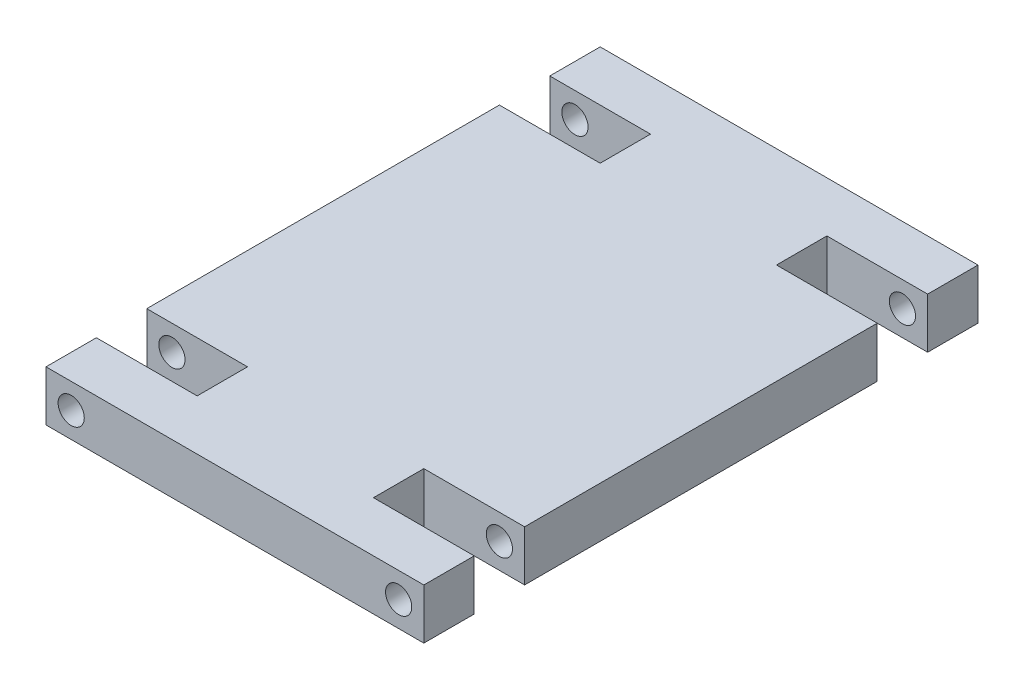
ISO-10303-21;
HEADER;
FILE_DESCRIPTION(('STEP AP214'),'2;1');
FILE_NAME('part.step','',(''),(''),'','','');
FILE_SCHEMA(('AUTOMOTIVE_DESIGN { 1 0 10303 214 1 1 1 1 }'));
ENDSEC;
DATA;
#1=APPLICATION_CONTEXT('core data for automotive mechanical design processes');
#2=APPLICATION_PROTOCOL_DEFINITION('international standard','automotive_design',2000,#1);
#3=PRODUCT_CONTEXT('',#1,'mechanical');
#4=PRODUCT('Part','Part','',(#3));
#5=PRODUCT_RELATED_PRODUCT_CATEGORY('part','',(#4));
#6=PRODUCT_DEFINITION_FORMATION('','',#4);
#7=PRODUCT_DEFINITION_CONTEXT('part definition',#1,'design');
#8=PRODUCT_DEFINITION('design','',#6,#7);
#9=PRODUCT_DEFINITION_SHAPE('','',#8);
#10=(LENGTH_UNIT() NAMED_UNIT(*) SI_UNIT(.MILLI.,.METRE.));
#11=(NAMED_UNIT(*) PLANE_ANGLE_UNIT() SI_UNIT($,.RADIAN.));
#12=(NAMED_UNIT(*) SI_UNIT($,.STERADIAN.) SOLID_ANGLE_UNIT());
#13=UNCERTAINTY_MEASURE_WITH_UNIT(LENGTH_MEASURE(1.E-05),#10,'distance_accuracy_value','');
#14=(GEOMETRIC_REPRESENTATION_CONTEXT(3) GLOBAL_UNCERTAINTY_ASSIGNED_CONTEXT((#13)) GLOBAL_UNIT_ASSIGNED_CONTEXT((#10,
#11,#12)) REPRESENTATION_CONTEXT('',''));
#15=CARTESIAN_POINT('',(0.,0.,0.));
#16=DIRECTION('',(0.,0.,1.));
#17=DIRECTION('',(1.,0.,0.));
#18=AXIS2_PLACEMENT_3D('',#15,#16,#17);
#19=CARTESIAN_POINT('',(-37.5,5.,-45.));
#20=DIRECTION('',(1.,0.,0.));
#21=DIRECTION('',(0.,0.,-1.));
#22=AXIS2_PLACEMENT_3D('',#19,#20,#21);
#23=PLANE('',#22);
#24=DIRECTION('',(0.,0.,1.));
#25=VECTOR('',#24,1.);
#26=CARTESIAN_POINT('',(-37.5,-5.,-45.));
#27=LINE('',#26,#25);
#28=CARTESIAN_POINT('',(-37.5,-5.,-55.));
#29=VERTEX_POINT('',#28);
#30=CARTESIAN_POINT('',(-37.5,-5.,-45.));
#31=VERTEX_POINT('',#30);
#32=EDGE_CURVE('E201',#29,#31,#27,.T.);
#33=ORIENTED_EDGE('',*,*,#32,.T.);
#34=DIRECTION('',(0.,-1.,0.));
#35=VECTOR('',#34,1.);
#36=CARTESIAN_POINT('',(-37.5,5.,-45.));
#37=LINE('',#36,#35);
#38=CARTESIAN_POINT('',(-37.5,5.,-45.));
#39=VERTEX_POINT('',#38);
#40=EDGE_CURVE('E11',#39,#31,#37,.T.);
#41=ORIENTED_EDGE('',*,*,#40,.F.);
#42=DIRECTION('',(0.,0.,1.));
#43=VECTOR('',#42,1.);
#44=CARTESIAN_POINT('',(-37.5,5.,-45.));
#45=LINE('',#44,#43);
#46=CARTESIAN_POINT('',(-37.5,5.,-55.));
#47=VERTEX_POINT('',#46);
#48=EDGE_CURVE('E240',#47,#39,#45,.T.);
#49=ORIENTED_EDGE('',*,*,#48,.F.);
#50=DIRECTION('',(0.,-1.,0.));
#51=VECTOR('',#50,1.);
#52=CARTESIAN_POINT('',(-37.5,5.,-55.));
#53=LINE('',#52,#51);
#54=EDGE_CURVE('E197',#47,#29,#53,.T.);
#55=ORIENTED_EDGE('',*,*,#54,.T.);
#56=EDGE_LOOP('',(#33,#41,#49,#55));
#57=FACE_BOUND('',#56,.T.);
#58=ADVANCED_FACE('F33',(#57),#23,.F.);
#59=CARTESIAN_POINT('',(-37.5,5.,-45.));
#60=DIRECTION('',(0.,0.,-1.));
#61=DIRECTION('',(-1.,0.,0.));
#62=AXIS2_PLACEMENT_3D('',#59,#60,#61);
#63=PLANE('',#62);
#64=CARTESIAN_POINT('',(-32.5,0.,-45.));
#65=DIRECTION('',(0.,0.,-1.));
#66=DIRECTION('',(-1.,0.,0.));
#67=AXIS2_PLACEMENT_3D('',#64,#65,#66);
#68=CIRCLE('',#67,2.6);
#69=CARTESIAN_POINT('',(-35.1,0.,-45.));
#70=VERTEX_POINT('',#69);
#71=EDGE_CURVE('E637',#70,#70,#68,.T.);
#72=ORIENTED_EDGE('',*,*,#71,.T.);
#73=EDGE_LOOP('',(#72));
#74=FACE_BOUND('',#73,.T.);
#75=DIRECTION('',(1.,0.,0.));
#76=VECTOR('',#75,1.);
#77=CARTESIAN_POINT('',(-37.5,-5.,-45.));
#78=LINE('',#77,#76);
#79=CARTESIAN_POINT('',(-17.5,-5.,-45.));
#80=VERTEX_POINT('',#79);
#81=EDGE_CURVE('E204',#31,#80,#78,.T.);
#82=ORIENTED_EDGE('',*,*,#81,.T.);
#83=DIRECTION('',(0.,-1.,0.));
#84=VECTOR('',#83,1.);
#85=CARTESIAN_POINT('',(-17.5,5.,-45.));
#86=LINE('',#85,#84);
#87=CARTESIAN_POINT('',(-17.5,5.,-45.));
#88=VERTEX_POINT('',#87);
#89=EDGE_CURVE('E41',#88,#80,#86,.T.);
#90=ORIENTED_EDGE('',*,*,#89,.F.);
#91=DIRECTION('',(1.,0.,0.));
#92=VECTOR('',#91,1.);
#93=CARTESIAN_POINT('',(-37.5,5.,-45.));
#94=LINE('',#93,#92);
#95=EDGE_CURVE('E128',#39,#88,#94,.T.);
#96=ORIENTED_EDGE('',*,*,#95,.F.);
#97=ORIENTED_EDGE('',*,*,#40,.T.);
#98=EDGE_LOOP('',(#82,#90,#96,#97));
#99=FACE_BOUND('',#98,.T.);
#100=ADVANCED_FACE('F361',(#74,#99),#63,.F.);
#101=CARTESIAN_POINT('',(-17.5,5.,-45.));
#102=DIRECTION('',(1.,0.,0.));
#103=DIRECTION('',(0.,0.,-1.));
#104=AXIS2_PLACEMENT_3D('',#101,#102,#103);
#105=PLANE('',#104);
#106=DIRECTION('',(0.,0.,1.));
#107=VECTOR('',#106,1.);
#108=CARTESIAN_POINT('',(-17.5,-5.,-45.));
#109=LINE('',#108,#107);
#110=CARTESIAN_POINT('',(-17.5,-5.,-35.));
#111=VERTEX_POINT('',#110);
#112=EDGE_CURVE('E207',#80,#111,#109,.T.);
#113=ORIENTED_EDGE('',*,*,#112,.T.);
#114=DIRECTION('',(0.,-1.,0.));
#115=VECTOR('',#114,1.);
#116=CARTESIAN_POINT('',(-17.5,5.,-35.));
#117=LINE('',#116,#115);
#118=CARTESIAN_POINT('',(-17.5,5.,-35.));
#119=VERTEX_POINT('',#118);
#120=EDGE_CURVE('E283',#119,#111,#117,.T.);
#121=ORIENTED_EDGE('',*,*,#120,.F.);
#122=DIRECTION('',(0.,0.,1.));
#123=VECTOR('',#122,1.);
#124=CARTESIAN_POINT('',(-17.5,5.,-45.));
#125=LINE('',#124,#123);
#126=EDGE_CURVE('E291',#88,#119,#125,.T.);
#127=ORIENTED_EDGE('',*,*,#126,.F.);
#128=ORIENTED_EDGE('',*,*,#89,.T.);
#129=EDGE_LOOP('',(#113,#121,#127,#128));
#130=FACE_BOUND('',#129,.T.);
#131=ADVANCED_FACE('F289',(#130),#105,.F.);
#132=CARTESIAN_POINT('',(-17.5,5.,-35.));
#133=DIRECTION('',(0.,0.,1.));
#134=DIRECTION('',(1.,0.,0.));
#135=AXIS2_PLACEMENT_3D('',#132,#133,#134);
#136=PLANE('',#135);
#137=CARTESIAN_POINT('',(-32.5,0.,-35.));
#138=DIRECTION('',(0.,0.,1.));
#139=DIRECTION('',(1.,0.,0.));
#140=AXIS2_PLACEMENT_3D('',#137,#138,#139);
#141=CIRCLE('',#140,2.6);
#142=CARTESIAN_POINT('',(-29.9,0.,-35.));
#143=VERTEX_POINT('',#142);
#144=EDGE_CURVE('E636',#143,#143,#141,.T.);
#145=ORIENTED_EDGE('',*,*,#144,.T.);
#146=EDGE_LOOP('',(#145));
#147=FACE_BOUND('',#146,.T.);
#148=DIRECTION('',(-1.,0.,0.));
#149=VECTOR('',#148,1.);
#150=CARTESIAN_POINT('',(-17.5,-5.,-35.));
#151=LINE('',#150,#149);
#152=CARTESIAN_POINT('',(-37.5,-5.,-35.));
#153=VERTEX_POINT('',#152);
#154=EDGE_CURVE('E209',#111,#153,#151,.T.);
#155=ORIENTED_EDGE('',*,*,#154,.T.);
#156=DIRECTION('',(0.,-1.,0.));
#157=VECTOR('',#156,1.);
#158=CARTESIAN_POINT('',(-37.5,5.,-35.));
#159=LINE('',#158,#157);
#160=CARTESIAN_POINT('',(-37.5,5.,-35.));
#161=VERTEX_POINT('',#160);
#162=EDGE_CURVE('E280',#161,#153,#159,.T.);
#163=ORIENTED_EDGE('',*,*,#162,.F.);
#164=DIRECTION('',(-1.,0.,0.));
#165=VECTOR('',#164,1.);
#166=CARTESIAN_POINT('',(-17.5,5.,-35.));
#167=LINE('',#166,#165);
#168=EDGE_CURVE('E309',#119,#161,#167,.T.);
#169=ORIENTED_EDGE('',*,*,#168,.F.);
#170=ORIENTED_EDGE('',*,*,#120,.T.);
#171=EDGE_LOOP('',(#155,#163,#169,#170));
#172=FACE_BOUND('',#171,.T.);
#173=ADVANCED_FACE('F300',(#147,#172),#136,.F.);
#174=CARTESIAN_POINT('',(-37.5,5.,35.));
#175=DIRECTION('',(1.,0.,0.));
#176=DIRECTION('',(0.,0.,-1.));
#177=AXIS2_PLACEMENT_3D('',#174,#175,#176);
#178=PLANE('',#177);
#179=DIRECTION('',(0.,0.,1.));
#180=VECTOR('',#179,1.);
#181=CARTESIAN_POINT('',(-37.5,-5.,35.));
#182=LINE('',#181,#180);
#183=CARTESIAN_POINT('',(-37.5,-5.,35.));
#184=VERTEX_POINT('',#183);
#185=EDGE_CURVE('E211',#153,#184,#182,.T.);
#186=ORIENTED_EDGE('',*,*,#185,.T.);
#187=DIRECTION('',(0.,-1.,0.));
#188=VECTOR('',#187,1.);
#189=CARTESIAN_POINT('',(-37.5,5.,35.));
#190=LINE('',#189,#188);
#191=CARTESIAN_POINT('',(-37.5,5.,35.));
#192=VERTEX_POINT('',#191);
#193=EDGE_CURVE('E277',#192,#184,#190,.T.);
#194=ORIENTED_EDGE('',*,*,#193,.F.);
#195=DIRECTION('',(0.,0.,1.));
#196=VECTOR('',#195,1.);
#197=CARTESIAN_POINT('',(-37.5,5.,35.));
#198=LINE('',#197,#196);
#199=EDGE_CURVE('E306',#161,#192,#198,.T.);
#200=ORIENTED_EDGE('',*,*,#199,.F.);
#201=ORIENTED_EDGE('',*,*,#162,.T.);
#202=EDGE_LOOP('',(#186,#194,#200,#201));
#203=FACE_BOUND('',#202,.T.);
#204=ADVANCED_FACE('F304',(#203),#178,.F.);
#205=CARTESIAN_POINT('',(-37.5,5.,35.));
#206=DIRECTION('',(0.,0.,-1.));
#207=DIRECTION('',(-1.,0.,0.));
#208=AXIS2_PLACEMENT_3D('',#205,#206,#207);
#209=PLANE('',#208);
#210=CARTESIAN_POINT('',(-32.5,0.,35.));
#211=DIRECTION('',(0.,0.,-1.));
#212=DIRECTION('',(-1.,0.,0.));
#213=AXIS2_PLACEMENT_3D('',#210,#211,#212);
#214=CIRCLE('',#213,2.6);
#215=CARTESIAN_POINT('',(-35.1,0.,35.));
#216=VERTEX_POINT('',#215);
#217=EDGE_CURVE('E633',#216,#216,#214,.T.);
#218=ORIENTED_EDGE('',*,*,#217,.T.);
#219=EDGE_LOOP('',(#218));
#220=FACE_BOUND('',#219,.T.);
#221=DIRECTION('',(1.,0.,0.));
#222=VECTOR('',#221,1.);
#223=CARTESIAN_POINT('',(-37.5,-5.,35.));
#224=LINE('',#223,#222);
#225=CARTESIAN_POINT('',(-17.5,-5.,35.));
#226=VERTEX_POINT('',#225);
#227=EDGE_CURVE('E213',#184,#226,#224,.T.);
#228=ORIENTED_EDGE('',*,*,#227,.T.);
#229=DIRECTION('',(0.,-1.,0.));
#230=VECTOR('',#229,1.);
#231=CARTESIAN_POINT('',(-17.5,5.,35.));
#232=LINE('',#231,#230);
#233=CARTESIAN_POINT('',(-17.5,5.,35.));
#234=VERTEX_POINT('',#233);
#235=EDGE_CURVE('E274',#234,#226,#232,.T.);
#236=ORIENTED_EDGE('',*,*,#235,.F.);
#237=DIRECTION('',(1.,0.,0.));
#238=VECTOR('',#237,1.);
#239=CARTESIAN_POINT('',(-37.5,5.,35.));
#240=LINE('',#239,#238);
#241=EDGE_CURVE('E308',#192,#234,#240,.T.);
#242=ORIENTED_EDGE('',*,*,#241,.F.);
#243=ORIENTED_EDGE('',*,*,#193,.T.);
#244=EDGE_LOOP('',(#228,#236,#242,#243));
#245=FACE_BOUND('',#244,.T.);
#246=ADVANCED_FACE('F377',(#220,#245),#209,.F.);
#247=CARTESIAN_POINT('',(-17.5,5.,35.));
#248=DIRECTION('',(1.,0.,0.));
#249=DIRECTION('',(0.,0.,-1.));
#250=AXIS2_PLACEMENT_3D('',#247,#248,#249);
#251=PLANE('',#250);
#252=DIRECTION('',(0.,0.,1.));
#253=VECTOR('',#252,1.);
#254=CARTESIAN_POINT('',(-17.5,-5.,35.));
#255=LINE('',#254,#253);
#256=CARTESIAN_POINT('',(-17.5,-5.,45.));
#257=VERTEX_POINT('',#256);
#258=EDGE_CURVE('E215',#226,#257,#255,.T.);
#259=ORIENTED_EDGE('',*,*,#258,.T.);
#260=DIRECTION('',(0.,-1.,0.));
#261=VECTOR('',#260,1.);
#262=CARTESIAN_POINT('',(-17.5,5.,45.));
#263=LINE('',#262,#261);
#264=CARTESIAN_POINT('',(-17.5,5.,45.));
#265=VERTEX_POINT('',#264);
#266=EDGE_CURVE('E271',#265,#257,#263,.T.);
#267=ORIENTED_EDGE('',*,*,#266,.F.);
#268=DIRECTION('',(0.,0.,1.));
#269=VECTOR('',#268,1.);
#270=CARTESIAN_POINT('',(-17.5,5.,35.));
#271=LINE('',#270,#269);
#272=EDGE_CURVE('E311',#234,#265,#271,.T.);
#273=ORIENTED_EDGE('',*,*,#272,.F.);
#274=ORIENTED_EDGE('',*,*,#235,.T.);
#275=EDGE_LOOP('',(#259,#267,#273,#274));
#276=FACE_BOUND('',#275,.T.);
#277=ADVANCED_FACE('F380',(#276),#251,.F.);
#278=CARTESIAN_POINT('',(-17.5,5.,45.));
#279=DIRECTION('',(0.,0.,1.));
#280=DIRECTION('',(1.,0.,0.));
#281=AXIS2_PLACEMENT_3D('',#278,#279,#280);
#282=PLANE('',#281);
#283=CARTESIAN_POINT('',(-32.5,0.,45.));
#284=DIRECTION('',(0.,0.,1.));
#285=DIRECTION('',(1.,0.,0.));
#286=AXIS2_PLACEMENT_3D('',#283,#284,#285);
#287=CIRCLE('',#286,2.6);
#288=CARTESIAN_POINT('',(-29.9,0.,45.));
#289=VERTEX_POINT('',#288);
#290=EDGE_CURVE('E640',#289,#289,#287,.T.);
#291=ORIENTED_EDGE('',*,*,#290,.T.);
#292=EDGE_LOOP('',(#291));
#293=FACE_BOUND('',#292,.T.);
#294=DIRECTION('',(-1.,0.,0.));
#295=VECTOR('',#294,1.);
#296=CARTESIAN_POINT('',(-17.5,-5.,45.));
#297=LINE('',#296,#295);
#298=CARTESIAN_POINT('',(-37.5,-5.,45.));
#299=VERTEX_POINT('',#298);
#300=EDGE_CURVE('E217',#257,#299,#297,.T.);
#301=ORIENTED_EDGE('',*,*,#300,.T.);
#302=DIRECTION('',(0.,-1.,0.));
#303=VECTOR('',#302,1.);
#304=CARTESIAN_POINT('',(-37.5,5.,45.));
#305=LINE('',#304,#303);
#306=CARTESIAN_POINT('',(-37.5,5.,45.));
#307=VERTEX_POINT('',#306);
#308=EDGE_CURVE('E268',#307,#299,#305,.T.);
#309=ORIENTED_EDGE('',*,*,#308,.F.);
#310=DIRECTION('',(-1.,0.,0.));
#311=VECTOR('',#310,1.);
#312=CARTESIAN_POINT('',(-17.5,5.,45.));
#313=LINE('',#312,#311);
#314=EDGE_CURVE('E317',#265,#307,#313,.T.);
#315=ORIENTED_EDGE('',*,*,#314,.F.);
#316=ORIENTED_EDGE('',*,*,#266,.T.);
#317=EDGE_LOOP('',(#301,#309,#315,#316));
#318=FACE_BOUND('',#317,.T.);
#319=ADVANCED_FACE('F384',(#293,#318),#282,.F.);
#320=CARTESIAN_POINT('',(-37.5,5.,55.));
#321=DIRECTION('',(1.,0.,0.));
#322=DIRECTION('',(0.,0.,-1.));
#323=AXIS2_PLACEMENT_3D('',#320,#321,#322);
#324=PLANE('',#323);
#325=DIRECTION('',(0.,0.,1.));
#326=VECTOR('',#325,1.);
#327=CARTESIAN_POINT('',(-37.5,-5.,55.));
#328=LINE('',#327,#326);
#329=CARTESIAN_POINT('',(-37.5,-5.,55.));
#330=VERTEX_POINT('',#329);
#331=EDGE_CURVE('E219',#299,#330,#328,.T.);
#332=ORIENTED_EDGE('',*,*,#331,.T.);
#333=DIRECTION('',(0.,-1.,0.));
#334=VECTOR('',#333,1.);
#335=CARTESIAN_POINT('',(-37.5,5.,55.));
#336=LINE('',#335,#334);
#337=CARTESIAN_POINT('',(-37.5,5.,55.));
#338=VERTEX_POINT('',#337);
#339=EDGE_CURVE('E265',#338,#330,#336,.T.);
#340=ORIENTED_EDGE('',*,*,#339,.F.);
#341=DIRECTION('',(0.,0.,1.));
#342=VECTOR('',#341,1.);
#343=CARTESIAN_POINT('',(-37.5,5.,55.));
#344=LINE('',#343,#342);
#345=EDGE_CURVE('E319',#307,#338,#344,.T.);
#346=ORIENTED_EDGE('',*,*,#345,.F.);
#347=ORIENTED_EDGE('',*,*,#308,.T.);
#348=EDGE_LOOP('',(#332,#340,#346,#347));
#349=FACE_BOUND('',#348,.T.);
#350=ADVANCED_FACE('F388',(#349),#324,.F.);
#351=CARTESIAN_POINT('',(37.5,5.,55.));
#352=DIRECTION('',(0.,0.,-1.));
#353=DIRECTION('',(-1.,0.,0.));
#354=AXIS2_PLACEMENT_3D('',#351,#352,#353);
#355=PLANE('',#354);
#356=CARTESIAN_POINT('',(-32.5,0.,55.));
#357=DIRECTION('',(0.,0.,1.));
#358=DIRECTION('',(-1.,0.,0.));
#359=AXIS2_PLACEMENT_3D('',#356,#357,#358);
#360=CIRCLE('',#359,2.6);
#361=CARTESIAN_POINT('',(-35.1,0.,55.));
#362=VERTEX_POINT('',#361);
#363=EDGE_CURVE('E679',#362,#362,#360,.T.);
#364=ORIENTED_EDGE('',*,*,#363,.F.);
#365=EDGE_LOOP('',(#364));
#366=FACE_BOUND('',#365,.T.);
#367=CARTESIAN_POINT('',(32.5,0.,55.));
#368=DIRECTION('',(0.,0.,1.));
#369=DIRECTION('',(1.,0.,0.));
#370=AXIS2_PLACEMENT_3D('',#367,#368,#369);
#371=CIRCLE('',#370,2.6);
#372=CARTESIAN_POINT('',(35.1,0.,55.));
#373=VERTEX_POINT('',#372);
#374=EDGE_CURVE('E437',#373,#373,#371,.T.);
#375=ORIENTED_EDGE('',*,*,#374,.F.);
#376=EDGE_LOOP('',(#375));
#377=FACE_BOUND('',#376,.T.);
#378=DIRECTION('',(1.,0.,0.));
#379=VECTOR('',#378,1.);
#380=CARTESIAN_POINT('',(37.5,-5.,55.));
#381=LINE('',#380,#379);
#382=CARTESIAN_POINT('',(37.5,-5.,55.));
#383=VERTEX_POINT('',#382);
#384=EDGE_CURVE('E221',#330,#383,#381,.T.);
#385=ORIENTED_EDGE('',*,*,#384,.T.);
#386=DIRECTION('',(0.,-1.,0.));
#387=VECTOR('',#386,1.);
#388=CARTESIAN_POINT('',(37.5,5.,55.));
#389=LINE('',#388,#387);
#390=CARTESIAN_POINT('',(37.5,5.,55.));
#391=VERTEX_POINT('',#390);
#392=EDGE_CURVE('E262',#391,#383,#389,.T.);
#393=ORIENTED_EDGE('',*,*,#392,.F.);
#394=DIRECTION('',(1.,0.,0.));
#395=VECTOR('',#394,1.);
#396=CARTESIAN_POINT('',(37.5,5.,55.));
#397=LINE('',#396,#395);
#398=EDGE_CURVE('E321',#338,#391,#397,.T.);
#399=ORIENTED_EDGE('',*,*,#398,.F.);
#400=ORIENTED_EDGE('',*,*,#339,.T.);
#401=EDGE_LOOP('',(#385,#393,#399,#400));
#402=FACE_BOUND('',#401,.T.);
#403=ADVANCED_FACE('F392',(#366,#377,#402),#355,.F.);
#404=CARTESIAN_POINT('',(37.5,5.,55.));
#405=DIRECTION('',(-1.,0.,0.));
#406=DIRECTION('',(0.,0.,1.));
#407=AXIS2_PLACEMENT_3D('',#404,#405,#406);
#408=PLANE('',#407);
#409=DIRECTION('',(0.,0.,-1.));
#410=VECTOR('',#409,1.);
#411=CARTESIAN_POINT('',(37.5,-5.,55.));
#412=LINE('',#411,#410);
#413=CARTESIAN_POINT('',(37.5,-5.,45.));
#414=VERTEX_POINT('',#413);
#415=EDGE_CURVE('E223',#383,#414,#412,.T.);
#416=ORIENTED_EDGE('',*,*,#415,.T.);
#417=DIRECTION('',(0.,-1.,0.));
#418=VECTOR('',#417,1.);
#419=CARTESIAN_POINT('',(37.5,5.,45.));
#420=LINE('',#419,#418);
#421=CARTESIAN_POINT('',(37.5,5.,45.));
#422=VERTEX_POINT('',#421);
#423=EDGE_CURVE('E259',#422,#414,#420,.T.);
#424=ORIENTED_EDGE('',*,*,#423,.F.);
#425=DIRECTION('',(0.,0.,-1.));
#426=VECTOR('',#425,1.);
#427=CARTESIAN_POINT('',(37.5,5.,55.));
#428=LINE('',#427,#426);
#429=EDGE_CURVE('E323',#391,#422,#428,.T.);
#430=ORIENTED_EDGE('',*,*,#429,.F.);
#431=ORIENTED_EDGE('',*,*,#392,.T.);
#432=EDGE_LOOP('',(#416,#424,#430,#431));
#433=FACE_BOUND('',#432,.T.);
#434=ADVANCED_FACE('F396',(#433),#408,.F.);
#435=CARTESIAN_POINT('',(17.5,5.,45.));
#436=DIRECTION('',(0.,0.,1.));
#437=DIRECTION('',(1.,0.,0.));
#438=AXIS2_PLACEMENT_3D('',#435,#436,#437);
#439=PLANE('',#438);
#440=CARTESIAN_POINT('',(32.5,0.,45.));
#441=DIRECTION('',(0.,0.,1.));
#442=DIRECTION('',(1.,0.,0.));
#443=AXIS2_PLACEMENT_3D('',#440,#441,#442);
#444=CIRCLE('',#443,2.6);
#445=CARTESIAN_POINT('',(35.1,0.,45.));
#446=VERTEX_POINT('',#445);
#447=EDGE_CURVE('E205',#446,#446,#444,.T.);
#448=ORIENTED_EDGE('',*,*,#447,.T.);
#449=EDGE_LOOP('',(#448));
#450=FACE_BOUND('',#449,.T.);
#451=DIRECTION('',(-1.,0.,0.));
#452=VECTOR('',#451,1.);
#453=CARTESIAN_POINT('',(17.5,-5.,45.));
#454=LINE('',#453,#452);
#455=CARTESIAN_POINT('',(17.5,-5.,45.));
#456=VERTEX_POINT('',#455);
#457=EDGE_CURVE('E225',#414,#456,#454,.T.);
#458=ORIENTED_EDGE('',*,*,#457,.T.);
#459=DIRECTION('',(0.,-1.,0.));
#460=VECTOR('',#459,1.);
#461=CARTESIAN_POINT('',(17.5,5.,45.));
#462=LINE('',#461,#460);
#463=CARTESIAN_POINT('',(17.5,5.,45.));
#464=VERTEX_POINT('',#463);
#465=EDGE_CURVE('E256',#464,#456,#462,.T.);
#466=ORIENTED_EDGE('',*,*,#465,.F.);
#467=DIRECTION('',(-1.,0.,0.));
#468=VECTOR('',#467,1.);
#469=CARTESIAN_POINT('',(17.5,5.,45.));
#470=LINE('',#469,#468);
#471=EDGE_CURVE('E325',#422,#464,#470,.T.);
#472=ORIENTED_EDGE('',*,*,#471,.F.);
#473=ORIENTED_EDGE('',*,*,#423,.T.);
#474=EDGE_LOOP('',(#458,#466,#472,#473));
#475=FACE_BOUND('',#474,.T.);
#476=ADVANCED_FACE('F400',(#450,#475),#439,.F.);
#477=CARTESIAN_POINT('',(17.5,5.,35.));
#478=DIRECTION('',(-1.,0.,0.));
#479=DIRECTION('',(0.,0.,1.));
#480=AXIS2_PLACEMENT_3D('',#477,#478,#479);
#481=PLANE('',#480);
#482=DIRECTION('',(0.,0.,-1.));
#483=VECTOR('',#482,1.);
#484=CARTESIAN_POINT('',(17.5,-5.,35.));
#485=LINE('',#484,#483);
#486=CARTESIAN_POINT('',(17.5,-5.,35.));
#487=VERTEX_POINT('',#486);
#488=EDGE_CURVE('E227',#456,#487,#485,.T.);
#489=ORIENTED_EDGE('',*,*,#488,.T.);
#490=DIRECTION('',(0.,-1.,0.));
#491=VECTOR('',#490,1.);
#492=CARTESIAN_POINT('',(17.5,5.,35.));
#493=LINE('',#492,#491);
#494=CARTESIAN_POINT('',(17.5,5.,35.));
#495=VERTEX_POINT('',#494);
#496=EDGE_CURVE('E253',#495,#487,#493,.T.);
#497=ORIENTED_EDGE('',*,*,#496,.F.);
#498=DIRECTION('',(0.,0.,-1.));
#499=VECTOR('',#498,1.);
#500=CARTESIAN_POINT('',(17.5,5.,35.));
#501=LINE('',#500,#499);
#502=EDGE_CURVE('E327',#464,#495,#501,.T.);
#503=ORIENTED_EDGE('',*,*,#502,.F.);
#504=ORIENTED_EDGE('',*,*,#465,.T.);
#505=EDGE_LOOP('',(#489,#497,#503,#504));
#506=FACE_BOUND('',#505,.T.);
#507=ADVANCED_FACE('F404',(#506),#481,.F.);
#508=CARTESIAN_POINT('',(37.5,5.,35.));
#509=DIRECTION('',(0.,0.,-1.));
#510=DIRECTION('',(-1.,0.,0.));
#511=AXIS2_PLACEMENT_3D('',#508,#509,#510);
#512=PLANE('',#511);
#513=CARTESIAN_POINT('',(32.5,0.,35.));
#514=DIRECTION('',(0.,0.,-1.));
#515=DIRECTION('',(-1.,0.,0.));
#516=AXIS2_PLACEMENT_3D('',#513,#514,#515);
#517=CIRCLE('',#516,2.6);
#518=CARTESIAN_POINT('',(29.9,0.,35.));
#519=VERTEX_POINT('',#518);
#520=EDGE_CURVE('E434',#519,#519,#517,.T.);
#521=ORIENTED_EDGE('',*,*,#520,.T.);
#522=EDGE_LOOP('',(#521));
#523=FACE_BOUND('',#522,.T.);
#524=DIRECTION('',(1.,0.,0.));
#525=VECTOR('',#524,1.);
#526=CARTESIAN_POINT('',(37.5,-5.,35.));
#527=LINE('',#526,#525);
#528=CARTESIAN_POINT('',(37.5,-5.,35.));
#529=VERTEX_POINT('',#528);
#530=EDGE_CURVE('E229',#487,#529,#527,.T.);
#531=ORIENTED_EDGE('',*,*,#530,.T.);
#532=DIRECTION('',(0.,-1.,0.));
#533=VECTOR('',#532,1.);
#534=CARTESIAN_POINT('',(37.5,5.,35.));
#535=LINE('',#534,#533);
#536=CARTESIAN_POINT('',(37.5,5.,35.));
#537=VERTEX_POINT('',#536);
#538=EDGE_CURVE('E250',#537,#529,#535,.T.);
#539=ORIENTED_EDGE('',*,*,#538,.F.);
#540=DIRECTION('',(1.,0.,0.));
#541=VECTOR('',#540,1.);
#542=CARTESIAN_POINT('',(37.5,5.,35.));
#543=LINE('',#542,#541);
#544=EDGE_CURVE('E329',#495,#537,#543,.T.);
#545=ORIENTED_EDGE('',*,*,#544,.F.);
#546=ORIENTED_EDGE('',*,*,#496,.T.);
#547=EDGE_LOOP('',(#531,#539,#545,#546));
#548=FACE_BOUND('',#547,.T.);
#549=ADVANCED_FACE('F408',(#523,#548),#512,.F.);
#550=CARTESIAN_POINT('',(37.5,5.,35.));
#551=DIRECTION('',(-1.,0.,0.));
#552=DIRECTION('',(0.,0.,1.));
#553=AXIS2_PLACEMENT_3D('',#550,#551,#552);
#554=PLANE('',#553);
#555=DIRECTION('',(0.,0.,-1.));
#556=VECTOR('',#555,1.);
#557=CARTESIAN_POINT('',(37.5,-5.,35.));
#558=LINE('',#557,#556);
#559=CARTESIAN_POINT('',(37.5,-5.,-35.));
#560=VERTEX_POINT('',#559);
#561=EDGE_CURVE('E231',#529,#560,#558,.T.);
#562=ORIENTED_EDGE('',*,*,#561,.T.);
#563=DIRECTION('',(0.,-1.,0.));
#564=VECTOR('',#563,1.);
#565=CARTESIAN_POINT('',(37.5,5.,-35.));
#566=LINE('',#565,#564);
#567=CARTESIAN_POINT('',(37.5,5.,-35.));
#568=VERTEX_POINT('',#567);
#569=EDGE_CURVE('E247',#568,#560,#566,.T.);
#570=ORIENTED_EDGE('',*,*,#569,.F.);
#571=DIRECTION('',(0.,0.,-1.));
#572=VECTOR('',#571,1.);
#573=CARTESIAN_POINT('',(37.5,5.,35.));
#574=LINE('',#573,#572);
#575=EDGE_CURVE('E331',#537,#568,#574,.T.);
#576=ORIENTED_EDGE('',*,*,#575,.F.);
#577=ORIENTED_EDGE('',*,*,#538,.T.);
#578=EDGE_LOOP('',(#562,#570,#576,#577));
#579=FACE_BOUND('',#578,.T.);
#580=ADVANCED_FACE('F412',(#579),#554,.F.);
#581=CARTESIAN_POINT('',(17.5,5.,-35.));
#582=DIRECTION('',(0.,0.,1.));
#583=DIRECTION('',(1.,0.,0.));
#584=AXIS2_PLACEMENT_3D('',#581,#582,#583);
#585=PLANE('',#584);
#586=CARTESIAN_POINT('',(32.5,0.,-35.));
#587=DIRECTION('',(0.,0.,1.));
#588=DIRECTION('',(1.,0.,0.));
#589=AXIS2_PLACEMENT_3D('',#586,#587,#588);
#590=CIRCLE('',#589,2.6);
#591=CARTESIAN_POINT('',(35.1,0.,-35.));
#592=VERTEX_POINT('',#591);
#593=EDGE_CURVE('E430',#592,#592,#590,.T.);
#594=ORIENTED_EDGE('',*,*,#593,.T.);
#595=EDGE_LOOP('',(#594));
#596=FACE_BOUND('',#595,.T.);
#597=DIRECTION('',(-1.,0.,0.));
#598=VECTOR('',#597,1.);
#599=CARTESIAN_POINT('',(17.5,-5.,-35.));
#600=LINE('',#599,#598);
#601=CARTESIAN_POINT('',(17.5,-5.,-35.));
#602=VERTEX_POINT('',#601);
#603=EDGE_CURVE('E233',#560,#602,#600,.T.);
#604=ORIENTED_EDGE('',*,*,#603,.T.);
#605=DIRECTION('',(0.,-1.,0.));
#606=VECTOR('',#605,1.);
#607=CARTESIAN_POINT('',(17.5,5.,-35.));
#608=LINE('',#607,#606);
#609=CARTESIAN_POINT('',(17.5,5.,-35.));
#610=VERTEX_POINT('',#609);
#611=EDGE_CURVE('E244',#610,#602,#608,.T.);
#612=ORIENTED_EDGE('',*,*,#611,.F.);
#613=DIRECTION('',(-1.,0.,0.));
#614=VECTOR('',#613,1.);
#615=CARTESIAN_POINT('',(17.5,5.,-35.));
#616=LINE('',#615,#614);
#617=EDGE_CURVE('E333',#568,#610,#616,.T.);
#618=ORIENTED_EDGE('',*,*,#617,.F.);
#619=ORIENTED_EDGE('',*,*,#569,.T.);
#620=EDGE_LOOP('',(#604,#612,#618,#619));
#621=FACE_BOUND('',#620,.T.);
#622=ADVANCED_FACE('F339',(#596,#621),#585,.F.);
#623=CARTESIAN_POINT('',(17.5,5.,-45.));
#624=DIRECTION('',(-1.,0.,0.));
#625=DIRECTION('',(0.,0.,1.));
#626=AXIS2_PLACEMENT_3D('',#623,#624,#625);
#627=PLANE('',#626);
#628=DIRECTION('',(0.,0.,-1.));
#629=VECTOR('',#628,1.);
#630=CARTESIAN_POINT('',(17.5,-5.,-45.));
#631=LINE('',#630,#629);
#632=CARTESIAN_POINT('',(17.5,-5.,-45.));
#633=VERTEX_POINT('',#632);
#634=EDGE_CURVE('E235',#602,#633,#631,.T.);
#635=ORIENTED_EDGE('',*,*,#634,.T.);
#636=DIRECTION('',(0.,-1.,0.));
#637=VECTOR('',#636,1.);
#638=CARTESIAN_POINT('',(17.5,5.,-45.));
#639=LINE('',#638,#637);
#640=CARTESIAN_POINT('',(17.5,5.,-45.));
#641=VERTEX_POINT('',#640);
#642=EDGE_CURVE('E192',#641,#633,#639,.T.);
#643=ORIENTED_EDGE('',*,*,#642,.F.);
#644=DIRECTION('',(0.,0.,-1.));
#645=VECTOR('',#644,1.);
#646=CARTESIAN_POINT('',(17.5,5.,-45.));
#647=LINE('',#646,#645);
#648=EDGE_CURVE('E183',#610,#641,#647,.T.);
#649=ORIENTED_EDGE('',*,*,#648,.F.);
#650=ORIENTED_EDGE('',*,*,#611,.T.);
#651=EDGE_LOOP('',(#635,#643,#649,#650));
#652=FACE_BOUND('',#651,.T.);
#653=ADVANCED_FACE('F343',(#652),#627,.F.);
#654=CARTESIAN_POINT('',(37.5,5.,-45.));
#655=DIRECTION('',(0.,0.,-1.));
#656=DIRECTION('',(-1.,0.,0.));
#657=AXIS2_PLACEMENT_3D('',#654,#655,#656);
#658=PLANE('',#657);
#659=CARTESIAN_POINT('',(32.5,0.,-45.));
#660=DIRECTION('',(0.,0.,-1.));
#661=DIRECTION('',(-1.,0.,0.));
#662=AXIS2_PLACEMENT_3D('',#659,#660,#661);
#663=CIRCLE('',#662,2.6);
#664=CARTESIAN_POINT('',(29.9,0.,-45.));
#665=VERTEX_POINT('',#664);
#666=EDGE_CURVE('E428',#665,#665,#663,.T.);
#667=ORIENTED_EDGE('',*,*,#666,.T.);
#668=EDGE_LOOP('',(#667));
#669=FACE_BOUND('',#668,.T.);
#670=DIRECTION('',(1.,0.,0.));
#671=VECTOR('',#670,1.);
#672=CARTESIAN_POINT('',(37.5,-5.,-45.));
#673=LINE('',#672,#671);
#674=CARTESIAN_POINT('',(37.5,-5.,-45.));
#675=VERTEX_POINT('',#674);
#676=EDGE_CURVE('E191',#633,#675,#673,.T.);
#677=ORIENTED_EDGE('',*,*,#676,.T.);
#678=DIRECTION('',(0.,-1.,0.));
#679=VECTOR('',#678,1.);
#680=CARTESIAN_POINT('',(37.5,5.,-45.));
#681=LINE('',#680,#679);
#682=CARTESIAN_POINT('',(37.5,5.,-45.));
#683=VERTEX_POINT('',#682);
#684=EDGE_CURVE('E188',#683,#675,#681,.T.);
#685=ORIENTED_EDGE('',*,*,#684,.F.);
#686=DIRECTION('',(1.,0.,0.));
#687=VECTOR('',#686,1.);
#688=CARTESIAN_POINT('',(37.5,5.,-45.));
#689=LINE('',#688,#687);
#690=EDGE_CURVE('E177',#641,#683,#689,.T.);
#691=ORIENTED_EDGE('',*,*,#690,.F.);
#692=ORIENTED_EDGE('',*,*,#642,.T.);
#693=EDGE_LOOP('',(#677,#685,#691,#692));
#694=FACE_BOUND('',#693,.T.);
#695=ADVANCED_FACE('F189',(#669,#694),#658,.F.);
#696=CARTESIAN_POINT('',(37.5,5.,-45.));
#697=DIRECTION('',(-1.,0.,0.));
#698=DIRECTION('',(0.,0.,1.));
#699=AXIS2_PLACEMENT_3D('',#696,#697,#698);
#700=PLANE('',#699);
#701=DIRECTION('',(0.,0.,-1.));
#702=VECTOR('',#701,1.);
#703=CARTESIAN_POINT('',(37.5,-5.,-45.));
#704=LINE('',#703,#702);
#705=CARTESIAN_POINT('',(37.5,-5.,-55.));
#706=VERTEX_POINT('',#705);
#707=EDGE_CURVE('E114',#675,#706,#704,.T.);
#708=ORIENTED_EDGE('',*,*,#707,.T.);
#709=DIRECTION('',(0.,-1.,0.));
#710=VECTOR('',#709,1.);
#711=CARTESIAN_POINT('',(37.5,5.,-55.));
#712=LINE('',#711,#710);
#713=CARTESIAN_POINT('',(37.5,5.,-55.));
#714=VERTEX_POINT('',#713);
#715=EDGE_CURVE('E193',#714,#706,#712,.T.);
#716=ORIENTED_EDGE('',*,*,#715,.F.);
#717=DIRECTION('',(0.,0.,-1.));
#718=VECTOR('',#717,1.);
#719=CARTESIAN_POINT('',(37.5,5.,-45.));
#720=LINE('',#719,#718);
#721=EDGE_CURVE('E181',#683,#714,#720,.T.);
#722=ORIENTED_EDGE('',*,*,#721,.F.);
#723=ORIENTED_EDGE('',*,*,#684,.T.);
#724=EDGE_LOOP('',(#708,#716,#722,#723));
#725=FACE_BOUND('',#724,.T.);
#726=ADVANCED_FACE('F195',(#725),#700,.F.);
#727=CARTESIAN_POINT('',(37.5,5.,-55.));
#728=DIRECTION('',(0.,0.,1.));
#729=DIRECTION('',(1.,0.,0.));
#730=AXIS2_PLACEMENT_3D('',#727,#728,#729);
#731=PLANE('',#730);
#732=CARTESIAN_POINT('',(-32.5,0.,-55.));
#733=DIRECTION('',(0.,0.,1.));
#734=DIRECTION('',(-1.,0.,0.));
#735=AXIS2_PLACEMENT_3D('',#732,#733,#734);
#736=CIRCLE('',#735,2.6);
#737=CARTESIAN_POINT('',(-35.1,0.,-55.));
#738=VERTEX_POINT('',#737);
#739=EDGE_CURVE('E677',#738,#738,#736,.T.);
#740=ORIENTED_EDGE('',*,*,#739,.T.);
#741=EDGE_LOOP('',(#740));
#742=FACE_BOUND('',#741,.T.);
#743=CARTESIAN_POINT('',(32.5,0.,-55.));
#744=DIRECTION('',(0.,0.,1.));
#745=DIRECTION('',(1.,0.,0.));
#746=AXIS2_PLACEMENT_3D('',#743,#744,#745);
#747=CIRCLE('',#746,2.6);
#748=CARTESIAN_POINT('',(35.1,0.,-55.));
#749=VERTEX_POINT('',#748);
#750=EDGE_CURVE('E431',#749,#749,#747,.T.);
#751=ORIENTED_EDGE('',*,*,#750,.T.);
#752=EDGE_LOOP('',(#751));
#753=FACE_BOUND('',#752,.T.);
#754=DIRECTION('',(-1.,0.,0.));
#755=VECTOR('',#754,1.);
#756=CARTESIAN_POINT('',(37.5,-5.,-55.));
#757=LINE('',#756,#755);
#758=EDGE_CURVE('E120',#706,#29,#757,.T.);
#759=ORIENTED_EDGE('',*,*,#758,.T.);
#760=ORIENTED_EDGE('',*,*,#54,.F.);
#761=DIRECTION('',(-1.,0.,0.));
#762=VECTOR('',#761,1.);
#763=CARTESIAN_POINT('',(37.5,5.,-55.));
#764=LINE('',#763,#762);
#765=EDGE_CURVE('E49',#714,#47,#764,.T.);
#766=ORIENTED_EDGE('',*,*,#765,.F.);
#767=ORIENTED_EDGE('',*,*,#715,.T.);
#768=EDGE_LOOP('',(#759,#760,#766,#767));
#769=FACE_BOUND('',#768,.T.);
#770=ADVANCED_FACE('F347',(#742,#753,#769),#731,.F.);
#771=CARTESIAN_POINT('',(0.,5.,0.));
#772=DIRECTION('',(0.,1.,0.));
#773=DIRECTION('',(0.,0.,1.));
#774=AXIS2_PLACEMENT_3D('',#771,#772,#773);
#775=PLANE('',#774);
#776=ORIENTED_EDGE('',*,*,#48,.T.);
#777=ORIENTED_EDGE('',*,*,#95,.T.);
#778=ORIENTED_EDGE('',*,*,#126,.T.);
#779=ORIENTED_EDGE('',*,*,#168,.T.);
#780=ORIENTED_EDGE('',*,*,#199,.T.);
#781=ORIENTED_EDGE('',*,*,#241,.T.);
#782=ORIENTED_EDGE('',*,*,#272,.T.);
#783=ORIENTED_EDGE('',*,*,#314,.T.);
#784=ORIENTED_EDGE('',*,*,#345,.T.);
#785=ORIENTED_EDGE('',*,*,#398,.T.);
#786=ORIENTED_EDGE('',*,*,#429,.T.);
#787=ORIENTED_EDGE('',*,*,#471,.T.);
#788=ORIENTED_EDGE('',*,*,#502,.T.);
#789=ORIENTED_EDGE('',*,*,#544,.T.);
#790=ORIENTED_EDGE('',*,*,#575,.T.);
#791=ORIENTED_EDGE('',*,*,#617,.T.);
#792=ORIENTED_EDGE('',*,*,#648,.T.);
#793=ORIENTED_EDGE('',*,*,#690,.T.);
#794=ORIENTED_EDGE('',*,*,#721,.T.);
#795=ORIENTED_EDGE('',*,*,#765,.T.);
#796=EDGE_LOOP('',(#776,#777,#778,#779,#780,#781,#782,#783,#784,#785,#786,#787,#788,#789,#790,
#791,#792,#793,#794,#795));
#797=FACE_BOUND('',#796,.T.);
#798=ADVANCED_FACE('F179',(#797),#775,.T.);
#799=CARTESIAN_POINT('',(0.,-5.,0.));
#800=DIRECTION('',(0.,1.,0.));
#801=DIRECTION('',(0.,0.,1.));
#802=AXIS2_PLACEMENT_3D('',#799,#800,#801);
#803=PLANE('',#802);
#804=ORIENTED_EDGE('',*,*,#32,.F.);
#805=ORIENTED_EDGE('',*,*,#758,.F.);
#806=ORIENTED_EDGE('',*,*,#707,.F.);
#807=ORIENTED_EDGE('',*,*,#676,.F.);
#808=ORIENTED_EDGE('',*,*,#634,.F.);
#809=ORIENTED_EDGE('',*,*,#603,.F.);
#810=ORIENTED_EDGE('',*,*,#561,.F.);
#811=ORIENTED_EDGE('',*,*,#530,.F.);
#812=ORIENTED_EDGE('',*,*,#488,.F.);
#813=ORIENTED_EDGE('',*,*,#457,.F.);
#814=ORIENTED_EDGE('',*,*,#415,.F.);
#815=ORIENTED_EDGE('',*,*,#384,.F.);
#816=ORIENTED_EDGE('',*,*,#331,.F.);
#817=ORIENTED_EDGE('',*,*,#300,.F.);
#818=ORIENTED_EDGE('',*,*,#258,.F.);
#819=ORIENTED_EDGE('',*,*,#227,.F.);
#820=ORIENTED_EDGE('',*,*,#185,.F.);
#821=ORIENTED_EDGE('',*,*,#154,.F.);
#822=ORIENTED_EDGE('',*,*,#112,.F.);
#823=ORIENTED_EDGE('',*,*,#81,.F.);
#824=EDGE_LOOP('',(#804,#805,#806,#807,#808,#809,#810,#811,#812,#813,#814,#815,#816,#817,#818,
#819,#820,#821,#822,#823));
#825=FACE_BOUND('',#824,.T.);
#826=ADVANCED_FACE('F295',(#825),#803,.F.);
#827=CARTESIAN_POINT('',(32.5,0.,-55.));
#828=DIRECTION('',(0.,0.,1.));
#829=DIRECTION('',(1.,0.,0.));
#830=AXIS2_PLACEMENT_3D('',#827,#828,#829);
#831=CYLINDRICAL_SURFACE('',#830,2.6);
#832=ORIENTED_EDGE('',*,*,#750,.F.);
#833=EDGE_LOOP('',(#832));
#834=FACE_BOUND('',#833,.T.);
#835=ORIENTED_EDGE('',*,*,#666,.F.);
#836=EDGE_LOOP('',(#835));
#837=FACE_BOUND('',#836,.T.);
#838=ADVANCED_FACE('F455',(#834,#837),#831,.F.);
#839=ORIENTED_EDGE('',*,*,#593,.F.);
#840=EDGE_LOOP('',(#839));
#841=FACE_BOUND('',#840,.T.);
#842=ORIENTED_EDGE('',*,*,#520,.F.);
#843=EDGE_LOOP('',(#842));
#844=FACE_BOUND('',#843,.T.);
#845=ADVANCED_FACE('F452',(#841,#844),#831,.F.);
#846=ORIENTED_EDGE('',*,*,#374,.T.);
#847=EDGE_LOOP('',(#846));
#848=FACE_BOUND('',#847,.T.);
#849=ORIENTED_EDGE('',*,*,#447,.F.);
#850=EDGE_LOOP('',(#849));
#851=FACE_BOUND('',#850,.T.);
#852=ADVANCED_FACE('F449',(#848,#851),#831,.F.);
#853=CARTESIAN_POINT('',(-32.5,0.,-55.));
#854=DIRECTION('',(0.,0.,1.));
#855=DIRECTION('',(1.,0.,0.));
#856=AXIS2_PLACEMENT_3D('',#853,#854,#855);
#857=CYLINDRICAL_SURFACE('',#856,2.6);
#858=ORIENTED_EDGE('',*,*,#739,.F.);
#859=EDGE_LOOP('',(#858));
#860=FACE_BOUND('',#859,.T.);
#861=ORIENTED_EDGE('',*,*,#71,.F.);
#862=EDGE_LOOP('',(#861));
#863=FACE_BOUND('',#862,.T.);
#864=ADVANCED_FACE('F451',(#860,#863),#857,.F.);
#865=ORIENTED_EDGE('',*,*,#363,.T.);
#866=EDGE_LOOP('',(#865));
#867=FACE_BOUND('',#866,.T.);
#868=ORIENTED_EDGE('',*,*,#290,.F.);
#869=EDGE_LOOP('',(#868));
#870=FACE_BOUND('',#869,.T.);
#871=ADVANCED_FACE('F460',(#867,#870),#857,.F.);
#872=ORIENTED_EDGE('',*,*,#217,.F.);
#873=EDGE_LOOP('',(#872));
#874=FACE_BOUND('',#873,.T.);
#875=ORIENTED_EDGE('',*,*,#144,.F.);
#876=EDGE_LOOP('',(#875));
#877=FACE_BOUND('',#876,.T.);
#878=ADVANCED_FACE('F463',(#874,#877),#857,.F.);
#879=CLOSED_SHELL('',(#58,#100,#131,#173,#204,#246,#277,#319,#350,#403,#434,#476,#507,#549,#580,
#622,#653,#695,#726,#770,#798,#826,#838,#845,#852,#864,#871,#878));
#880=MANIFOLD_SOLID_BREP('B2',#879);
#881=ADVANCED_BREP_SHAPE_REPRESENTATION('',(#18,#880),#14);
#882=SHAPE_DEFINITION_REPRESENTATION(#9,#881);
ENDSEC;
END-ISO-10303-21;
